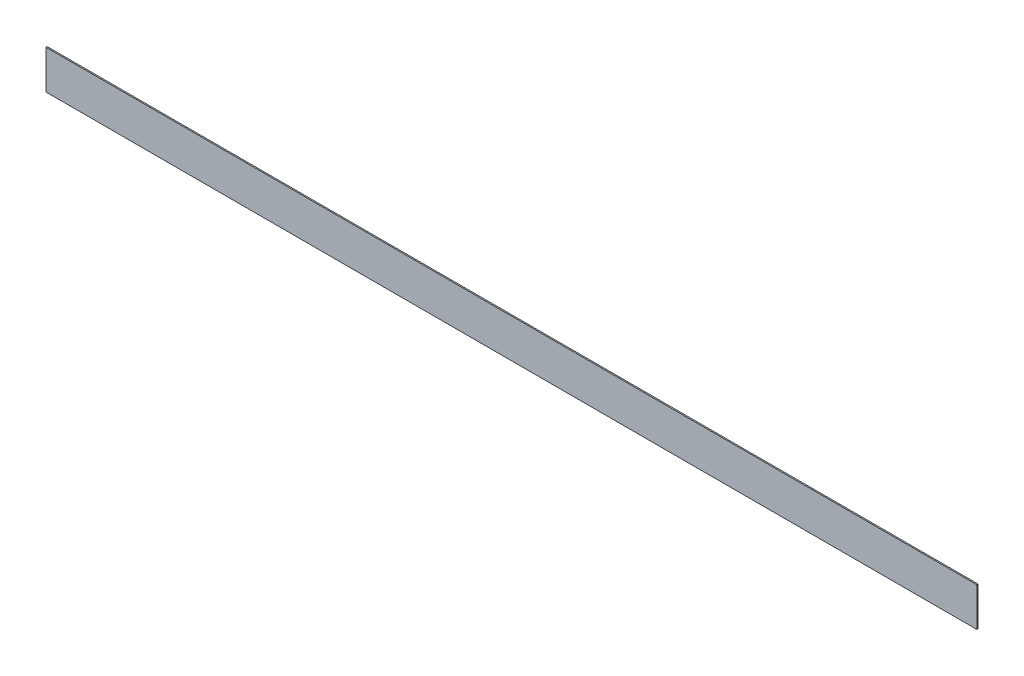
ISO-10303-21;
HEADER;
FILE_DESCRIPTION(('STEP AP214'),'2;1');
FILE_NAME('part.step','',(''),(''),'','','');
FILE_SCHEMA(('AUTOMOTIVE_DESIGN { 1 0 10303 214 1 1 1 1 }'));
ENDSEC;
DATA;
#1=APPLICATION_CONTEXT('core data for automotive mechanical design processes');
#2=APPLICATION_PROTOCOL_DEFINITION('international standard','automotive_design',2000,#1);
#3=PRODUCT_CONTEXT('',#1,'mechanical');
#4=PRODUCT('Part','Part','',(#3));
#5=PRODUCT_RELATED_PRODUCT_CATEGORY('part','',(#4));
#6=PRODUCT_DEFINITION_FORMATION('','',#4);
#7=PRODUCT_DEFINITION_CONTEXT('part definition',#1,'design');
#8=PRODUCT_DEFINITION('design','',#6,#7);
#9=PRODUCT_DEFINITION_SHAPE('','',#8);
#10=(LENGTH_UNIT() NAMED_UNIT(*) SI_UNIT(.MILLI.,.METRE.));
#11=(NAMED_UNIT(*) PLANE_ANGLE_UNIT() SI_UNIT($,.RADIAN.));
#12=(NAMED_UNIT(*) SI_UNIT($,.STERADIAN.) SOLID_ANGLE_UNIT());
#13=UNCERTAINTY_MEASURE_WITH_UNIT(LENGTH_MEASURE(1.E-05),#10,'distance_accuracy_value','');
#14=(GEOMETRIC_REPRESENTATION_CONTEXT(3) GLOBAL_UNCERTAINTY_ASSIGNED_CONTEXT((#13)) GLOBAL_UNIT_ASSIGNED_CONTEXT((#10,
#11,#12)) REPRESENTATION_CONTEXT('',''));
#15=CARTESIAN_POINT('',(0.,0.,0.));
#16=DIRECTION('',(0.,0.,1.));
#17=DIRECTION('',(1.,0.,0.));
#18=AXIS2_PLACEMENT_3D('',#15,#16,#17);
#19=CARTESIAN_POINT('',(0.,0.,1.5875));
#20=DIRECTION('',(-1.,0.,0.));
#21=DIRECTION('',(0.,0.,1.));
#22=AXIS2_PLACEMENT_3D('',#19,#20,#21);
#23=PLANE('',#22);
#24=DIRECTION('',(0.,1.,0.));
#25=VECTOR('',#24,1.);
#26=CARTESIAN_POINT('',(0.,0.,0.));
#27=LINE('',#26,#25);
#28=CARTESIAN_POINT('',(0.,-50.8,0.));
#29=VERTEX_POINT('',#28);
#30=CARTESIAN_POINT('',(0.,0.,0.));
#31=VERTEX_POINT('',#30);
#32=EDGE_CURVE('E100',#29,#31,#27,.T.);
#33=ORIENTED_EDGE('',*,*,#32,.T.);
#34=DIRECTION('',(0.,0.,-1.));
#35=VECTOR('',#34,1.);
#36=CARTESIAN_POINT('',(0.,0.,1.5875));
#37=LINE('',#36,#35);
#38=CARTESIAN_POINT('',(0.,0.,1.5875));
#39=VERTEX_POINT('',#38);
#40=EDGE_CURVE('E11',#39,#31,#37,.T.);
#41=ORIENTED_EDGE('',*,*,#40,.F.);
#42=DIRECTION('',(0.,1.,0.));
#43=VECTOR('',#42,1.);
#44=CARTESIAN_POINT('',(0.,0.,1.5875));
#45=LINE('',#44,#43);
#46=CARTESIAN_POINT('',(0.,-50.8,1.5875));
#47=VERTEX_POINT('',#46);
#48=EDGE_CURVE('E88',#47,#39,#45,.T.);
#49=ORIENTED_EDGE('',*,*,#48,.F.);
#50=DIRECTION('',(0.,0.,-1.));
#51=VECTOR('',#50,1.);
#52=CARTESIAN_POINT('',(0.,-50.8,1.5875));
#53=LINE('',#52,#51);
#54=EDGE_CURVE('E96',#47,#29,#53,.T.);
#55=ORIENTED_EDGE('',*,*,#54,.T.);
#56=EDGE_LOOP('',(#33,#41,#49,#55));
#57=FACE_BOUND('',#56,.T.);
#58=ADVANCED_FACE('F37',(#57),#23,.F.);
#59=CARTESIAN_POINT('',(0.,0.,1.5875));
#60=DIRECTION('',(0.,-1.,0.));
#61=DIRECTION('',(1.,0.,0.));
#62=AXIS2_PLACEMENT_3D('',#59,#60,#61);
#63=PLANE('',#62);
#64=DIRECTION('',(-1.,0.,0.));
#65=VECTOR('',#64,1.);
#66=CARTESIAN_POINT('',(0.,0.,0.));
#67=LINE('',#66,#65);
#68=CARTESIAN_POINT('',(-1219.2,-1.49308937752045E-13,0.));
#69=VERTEX_POINT('',#68);
#70=EDGE_CURVE('E92',#31,#69,#67,.T.);
#71=ORIENTED_EDGE('',*,*,#70,.T.);
#72=DIRECTION('',(0.,0.,-1.));
#73=VECTOR('',#72,1.);
#74=CARTESIAN_POINT('',(-1219.2,-1.49308937752045E-13,1.5875));
#75=LINE('',#74,#73);
#76=CARTESIAN_POINT('',(-1219.2,-1.49308937752045E-13,1.5875));
#77=VERTEX_POINT('',#76);
#78=EDGE_CURVE('E45',#77,#69,#75,.T.);
#79=ORIENTED_EDGE('',*,*,#78,.F.);
#80=DIRECTION('',(-1.,0.,0.));
#81=VECTOR('',#80,1.);
#82=CARTESIAN_POINT('',(0.,0.,1.5875));
#83=LINE('',#82,#81);
#84=EDGE_CURVE('E83',#39,#77,#83,.T.);
#85=ORIENTED_EDGE('',*,*,#84,.F.);
#86=ORIENTED_EDGE('',*,*,#40,.T.);
#87=EDGE_LOOP('',(#71,#79,#85,#86));
#88=FACE_BOUND('',#87,.T.);
#89=ADVANCED_FACE('F91',(#88),#63,.F.);
#90=CARTESIAN_POINT('',(-1219.2,-1.49308937752045E-13,1.5875));
#91=DIRECTION('',(1.,0.,0.));
#92=DIRECTION('',(0.,0.,-1.));
#93=AXIS2_PLACEMENT_3D('',#90,#91,#92);
#94=PLANE('',#93);
#95=DIRECTION('',(0.,-1.,0.));
#96=VECTOR('',#95,1.);
#97=CARTESIAN_POINT('',(-1219.2,-1.49308937752045E-13,0.));
#98=LINE('',#97,#96);
#99=CARTESIAN_POINT('',(-1219.2,-50.8000000000001,0.));
#100=VERTEX_POINT('',#99);
#101=EDGE_CURVE('E70',#69,#100,#98,.T.);
#102=ORIENTED_EDGE('',*,*,#101,.T.);
#103=DIRECTION('',(0.,0.,-1.));
#104=VECTOR('',#103,1.);
#105=CARTESIAN_POINT('',(-1219.2,-50.8000000000001,1.5875));
#106=LINE('',#105,#104);
#107=CARTESIAN_POINT('',(-1219.2,-50.8000000000001,1.5875));
#108=VERTEX_POINT('',#107);
#109=EDGE_CURVE('E93',#108,#100,#106,.T.);
#110=ORIENTED_EDGE('',*,*,#109,.F.);
#111=DIRECTION('',(0.,-1.,0.));
#112=VECTOR('',#111,1.);
#113=CARTESIAN_POINT('',(-1219.2,-1.49308937752045E-13,1.5875));
#114=LINE('',#113,#112);
#115=EDGE_CURVE('E86',#77,#108,#114,.T.);
#116=ORIENTED_EDGE('',*,*,#115,.F.);
#117=ORIENTED_EDGE('',*,*,#78,.T.);
#118=EDGE_LOOP('',(#102,#110,#116,#117));
#119=FACE_BOUND('',#118,.T.);
#120=ADVANCED_FACE('F94',(#119),#94,.F.);
#121=CARTESIAN_POINT('',(0.,-50.8,1.5875));
#122=DIRECTION('',(0.,1.,0.));
#123=DIRECTION('',(-1.,0.,0.));
#124=AXIS2_PLACEMENT_3D('',#121,#122,#123);
#125=PLANE('',#124);
#126=DIRECTION('',(1.,0.,0.));
#127=VECTOR('',#126,1.);
#128=CARTESIAN_POINT('',(0.,-50.8,0.));
#129=LINE('',#128,#127);
#130=EDGE_CURVE('E76',#100,#29,#129,.T.);
#131=ORIENTED_EDGE('',*,*,#130,.T.);
#132=ORIENTED_EDGE('',*,*,#54,.F.);
#133=DIRECTION('',(1.,0.,0.));
#134=VECTOR('',#133,1.);
#135=CARTESIAN_POINT('',(0.,-50.8,1.5875));
#136=LINE('',#135,#134);
#137=EDGE_CURVE('E53',#108,#47,#136,.T.);
#138=ORIENTED_EDGE('',*,*,#137,.F.);
#139=ORIENTED_EDGE('',*,*,#109,.T.);
#140=EDGE_LOOP('',(#131,#132,#138,#139));
#141=FACE_BOUND('',#140,.T.);
#142=ADVANCED_FACE('F107',(#141),#125,.F.);
#143=CARTESIAN_POINT('',(0.,0.,1.5875));
#144=DIRECTION('',(0.,0.,-1.));
#145=DIRECTION('',(-1.,0.,0.));
#146=AXIS2_PLACEMENT_3D('',#143,#144,#145);
#147=PLANE('',#146);
#148=ORIENTED_EDGE('',*,*,#48,.T.);
#149=ORIENTED_EDGE('',*,*,#84,.T.);
#150=ORIENTED_EDGE('',*,*,#115,.T.);
#151=ORIENTED_EDGE('',*,*,#137,.T.);
#152=EDGE_LOOP('',(#148,#149,#150,#151));
#153=FACE_BOUND('',#152,.T.);
#154=ADVANCED_FACE('F84',(#153),#147,.F.);
#155=CARTESIAN_POINT('',(0.,0.,0.));
#156=DIRECTION('',(0.,0.,-1.));
#157=DIRECTION('',(-1.,0.,0.));
#158=AXIS2_PLACEMENT_3D('',#155,#156,#157);
#159=PLANE('',#158);
#160=ORIENTED_EDGE('',*,*,#32,.F.);
#161=ORIENTED_EDGE('',*,*,#130,.F.);
#162=ORIENTED_EDGE('',*,*,#101,.F.);
#163=ORIENTED_EDGE('',*,*,#70,.F.);
#164=EDGE_LOOP('',(#160,#161,#162,#163));
#165=FACE_BOUND('',#164,.T.);
#166=ADVANCED_FACE('F110',(#165),#159,.T.);
#167=CLOSED_SHELL('',(#58,#89,#120,#142,#154,#166));
#168=MANIFOLD_SOLID_BREP('B2',#167);
#169=ADVANCED_BREP_SHAPE_REPRESENTATION('',(#18,#168),#14);
#170=SHAPE_DEFINITION_REPRESENTATION(#9,#169);
ENDSEC;
END-ISO-10303-21;
